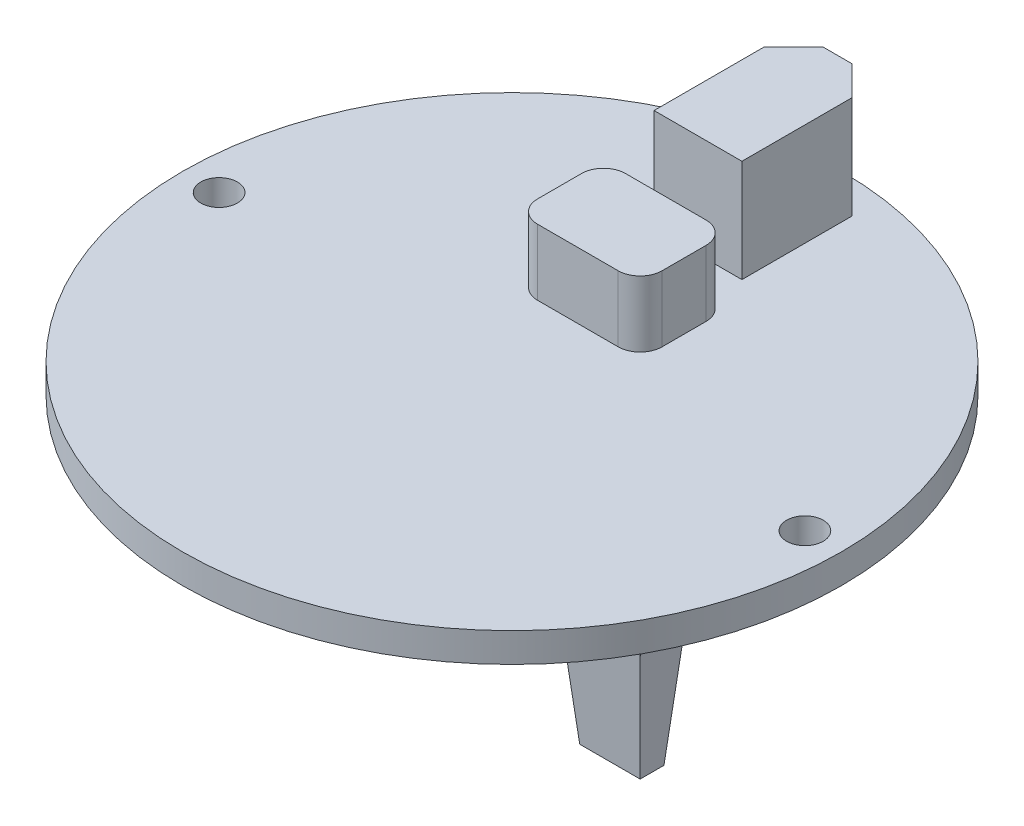
ISO-10303-21;
HEADER;
FILE_DESCRIPTION(('STEP AP214'),'2;1');
FILE_NAME('part.step','',(''),(''),'','','');
FILE_SCHEMA(('AUTOMOTIVE_DESIGN { 1 0 10303 214 1 1 1 1 }'));
ENDSEC;
DATA;
#1=APPLICATION_CONTEXT('core data for automotive mechanical design processes');
#2=APPLICATION_PROTOCOL_DEFINITION('international standard','automotive_design',2000,#1);
#3=PRODUCT_CONTEXT('',#1,'mechanical');
#4=PRODUCT('Part','Part','',(#3));
#5=PRODUCT_RELATED_PRODUCT_CATEGORY('part','',(#4));
#6=PRODUCT_DEFINITION_FORMATION('','',#4);
#7=PRODUCT_DEFINITION_CONTEXT('part definition',#1,'design');
#8=PRODUCT_DEFINITION('design','',#6,#7);
#9=PRODUCT_DEFINITION_SHAPE('','',#8);
#10=(LENGTH_UNIT() NAMED_UNIT(*) SI_UNIT(.MILLI.,.METRE.));
#11=(NAMED_UNIT(*) PLANE_ANGLE_UNIT() SI_UNIT($,.RADIAN.));
#12=(NAMED_UNIT(*) SI_UNIT($,.STERADIAN.) SOLID_ANGLE_UNIT());
#13=UNCERTAINTY_MEASURE_WITH_UNIT(LENGTH_MEASURE(1.E-05),#10,'distance_accuracy_value','');
#14=(GEOMETRIC_REPRESENTATION_CONTEXT(3) GLOBAL_UNCERTAINTY_ASSIGNED_CONTEXT((#13)) GLOBAL_UNIT_ASSIGNED_CONTEXT((#10,
#11,#12)) REPRESENTATION_CONTEXT('',''));
#15=CARTESIAN_POINT('',(0.,0.,0.));
#16=DIRECTION('',(0.,0.,1.));
#17=DIRECTION('',(1.,0.,0.));
#18=AXIS2_PLACEMENT_3D('',#15,#16,#17);
#19=CARTESIAN_POINT('',(-4.25,0.,0.));
#20=DIRECTION('',(-0.996194698091746,-0.0871557427476582,0.));
#21=DIRECTION('',(0.0871557427476582,-0.996194698091746,0.));
#22=AXIS2_PLACEMENT_3D('',#19,#20,#21);
#23=PLANE('',#22);
#24=DIRECTION('',(0.,0.,1.));
#25=VECTOR('',#24,1.);
#26=CARTESIAN_POINT('',(-4.25,0.,0.));
#27=LINE('',#26,#25);
#28=CARTESIAN_POINT('',(-4.25,0.,-9.));
#29=VERTEX_POINT('',#28);
#30=CARTESIAN_POINT('',(-4.25,0.,-6.));
#31=VERTEX_POINT('',#30);
#32=EDGE_CURVE('E172',#29,#31,#27,.T.);
#33=ORIENTED_EDGE('',*,*,#32,.F.);
#34=DIRECTION('',(-0.0871557427476582,0.996194698091746,0.));
#35=VECTOR('',#34,1.);
#36=CARTESIAN_POINT('',(-4.25,0.,-9.));
#37=LINE('',#36,#35);
#38=CARTESIAN_POINT('',(-2.75,-17.145078454142,-9.));
#39=VERTEX_POINT('',#38);
#40=EDGE_CURVE('E12',#39,#29,#37,.T.);
#41=ORIENTED_EDGE('',*,*,#40,.F.);
#42=DIRECTION('',(0.0868265938642476,-0.992432509138967,0.0868265938642476));
#43=VECTOR('',#42,1.);
#44=CARTESIAN_POINT('',(-4.1708419972783,-0.904780111291196,-10.4208419972783));
#45=LINE('',#44,#43);
#46=CARTESIAN_POINT('',(-2.0627834118519,-25.,-8.3127834118519));
#47=VERTEX_POINT('',#46);
#48=EDGE_CURVE('E59',#47,#39,#45,.F.);
#49=ORIENTED_EDGE('',*,*,#48,.F.);
#50=DIRECTION('',(0.,0.,1.));
#51=VECTOR('',#50,1.);
#52=CARTESIAN_POINT('',(-2.0627834118519,-25.,0.));
#53=LINE('',#52,#51);
#54=CARTESIAN_POINT('',(-2.0627834118519,-25.,-6.6872165881481));
#55=VERTEX_POINT('',#54);
#56=EDGE_CURVE('E197',#47,#55,#53,.T.);
#57=ORIENTED_EDGE('',*,*,#56,.T.);
#58=DIRECTION('',(-0.0868265938642476,0.992432509138967,0.0868265938642476));
#59=VECTOR('',#58,1.);
#60=CARTESIAN_POINT('',(-4.2839248583093,0.387762904839084,-4.4660751416907));
#61=LINE('',#60,#59);
#62=CARTESIAN_POINT('',(-2.75,-17.145078454142,-6.));
#63=VERTEX_POINT('',#62);
#64=EDGE_CURVE('E68',#55,#63,#61,.T.);
#65=ORIENTED_EDGE('',*,*,#64,.T.);
#66=DIRECTION('',(-0.0871557427476582,0.996194698091746,0.));
#67=VECTOR('',#66,1.);
#68=CARTESIAN_POINT('',(-4.25,0.,-6.));
#69=LINE('',#68,#67);
#70=EDGE_CURVE('E202',#63,#31,#69,.T.);
#71=ORIENTED_EDGE('',*,*,#70,.T.);
#72=EDGE_LOOP('',(#33,#41,#49,#57,#65,#71));
#73=FACE_BOUND('',#72,.T.);
#74=ADVANCED_FACE('F49',(#73),#23,.T.);
#75=CARTESIAN_POINT('',(-2.75,0.,-9.));
#76=DIRECTION('',(0.,1.,0.));
#77=DIRECTION('',(0.,0.,1.));
#78=AXIS2_PLACEMENT_3D('',#75,#76,#77);
#79=CONICAL_SURFACE('',#78,1.5,0.0872664625997165);
#80=DIRECTION('',(0.,0.996194698091746,-0.0871557427476582));
#81=VECTOR('',#80,1.);
#82=CARTESIAN_POINT('',(-2.75,0.,-10.5));
#83=LINE('',#82,#81);
#84=CARTESIAN_POINT('',(-2.75,0.,-10.5));
#85=VERTEX_POINT('',#84);
#86=EDGE_CURVE('E100',#39,#85,#83,.T.);
#87=ORIENTED_EDGE('',*,*,#86,.F.);
#88=ORIENTED_EDGE('',*,*,#40,.T.);
#89=CARTESIAN_POINT('',(-2.75,0.,-9.));
#90=DIRECTION('',(0.,1.,0.));
#91=DIRECTION('',(0.,0.,1.));
#92=AXIS2_PLACEMENT_3D('',#89,#90,#91);
#93=CIRCLE('',#92,1.5);
#94=EDGE_CURVE('E195',#85,#29,#93,.T.);
#95=ORIENTED_EDGE('',*,*,#94,.F.);
#96=EDGE_LOOP('',(#87,#88,#95));
#97=FACE_BOUND('',#96,.T.);
#98=ADVANCED_FACE('F51',(#97),#79,.T.);
#99=CARTESIAN_POINT('',(0.,0.,-10.5));
#100=DIRECTION('',(0.,-0.0871557427476582,-0.996194698091746));
#101=DIRECTION('',(0.,0.996194698091746,-0.0871557427476582));
#102=AXIS2_PLACEMENT_3D('',#99,#100,#101);
#103=PLANE('',#102);
#104=DIRECTION('',(1.,0.,0.));
#105=VECTOR('',#104,1.);
#106=CARTESIAN_POINT('',(0.,0.,-10.5));
#107=LINE('',#106,#105);
#108=CARTESIAN_POINT('',(2.75,0.,-10.5));
#109=VERTEX_POINT('',#108);
#110=EDGE_CURVE('E193',#85,#109,#107,.T.);
#111=ORIENTED_EDGE('',*,*,#110,.T.);
#112=DIRECTION('',(0.,0.996194698091746,-0.0871557427476582));
#113=VECTOR('',#112,1.);
#114=CARTESIAN_POINT('',(2.75,0.,-10.5));
#115=LINE('',#114,#113);
#116=CARTESIAN_POINT('',(2.75,-17.145078454142,-9.));
#117=VERTEX_POINT('',#116);
#118=EDGE_CURVE('E214',#117,#109,#115,.T.);
#119=ORIENTED_EDGE('',*,*,#118,.F.);
#120=DIRECTION('',(0.0868265938642476,0.992432509138967,-0.0868265938642476));
#121=VECTOR('',#120,1.);
#122=CARTESIAN_POINT('',(4.1708419972783,-0.904780111291196,-10.4208419972783));
#123=LINE('',#122,#121);
#124=CARTESIAN_POINT('',(2.0627834118519,-25.,-8.3127834118519));
#125=VERTEX_POINT('',#124);
#126=EDGE_CURVE('E212',#125,#117,#123,.T.);
#127=ORIENTED_EDGE('',*,*,#126,.F.);
#128=DIRECTION('',(-1.,0.,0.));
#129=VECTOR('',#128,1.);
#130=CARTESIAN_POINT('',(0.,-25.,-8.3127834118519));
#131=LINE('',#130,#129);
#132=EDGE_CURVE('E204',#47,#125,#131,.F.);
#133=ORIENTED_EDGE('',*,*,#132,.F.);
#134=ORIENTED_EDGE('',*,*,#48,.T.);
#135=ORIENTED_EDGE('',*,*,#86,.T.);
#136=EDGE_LOOP('',(#111,#119,#127,#133,#134,#135));
#137=FACE_BOUND('',#136,.T.);
#138=ADVANCED_FACE('F232',(#137),#103,.T.);
#139=CARTESIAN_POINT('',(2.75,0.,-9.));
#140=DIRECTION('',(0.,1.,0.));
#141=DIRECTION('',(0.,0.,1.));
#142=AXIS2_PLACEMENT_3D('',#139,#140,#141);
#143=CONICAL_SURFACE('',#142,1.5,0.0872664625997165);
#144=DIRECTION('',(0.0871557427476582,0.996194698091746,0.));
#145=VECTOR('',#144,1.);
#146=CARTESIAN_POINT('',(4.25,0.,-9.));
#147=LINE('',#146,#145);
#148=CARTESIAN_POINT('',(4.25,0.,-9.));
#149=VERTEX_POINT('',#148);
#150=EDGE_CURVE('E211',#117,#149,#147,.T.);
#151=ORIENTED_EDGE('',*,*,#150,.F.);
#152=ORIENTED_EDGE('',*,*,#118,.T.);
#153=CARTESIAN_POINT('',(2.75,0.,-9.));
#154=DIRECTION('',(0.,1.,0.));
#155=DIRECTION('',(0.,0.,1.));
#156=AXIS2_PLACEMENT_3D('',#153,#154,#155);
#157=CIRCLE('',#156,1.5);
#158=EDGE_CURVE('E190',#109,#149,#157,.F.);
#159=ORIENTED_EDGE('',*,*,#158,.T.);
#160=EDGE_LOOP('',(#151,#152,#159));
#161=FACE_BOUND('',#160,.T.);
#162=ADVANCED_FACE('F236',(#161),#143,.T.);
#163=CARTESIAN_POINT('',(4.25,0.,0.));
#164=DIRECTION('',(0.996194698091746,-0.0871557427476582,0.));
#165=DIRECTION('',(0.0871557427476582,0.996194698091746,0.));
#166=AXIS2_PLACEMENT_3D('',#163,#164,#165);
#167=PLANE('',#166);
#168=DIRECTION('',(0.,0.,1.));
#169=VECTOR('',#168,1.);
#170=CARTESIAN_POINT('',(4.25,0.,0.));
#171=LINE('',#170,#169);
#172=CARTESIAN_POINT('',(4.25,0.,-6.));
#173=VERTEX_POINT('',#172);
#174=EDGE_CURVE('E187',#149,#173,#171,.T.);
#175=ORIENTED_EDGE('',*,*,#174,.T.);
#176=DIRECTION('',(0.0871557427476582,0.996194698091746,0.));
#177=VECTOR('',#176,1.);
#178=CARTESIAN_POINT('',(4.25,0.,-6.));
#179=LINE('',#178,#177);
#180=CARTESIAN_POINT('',(2.75,-17.145078454142,-6.));
#181=VERTEX_POINT('',#180);
#182=EDGE_CURVE('E208',#181,#173,#179,.T.);
#183=ORIENTED_EDGE('',*,*,#182,.F.);
#184=DIRECTION('',(-0.0868265938642476,-0.992432509138967,-0.0868265938642476));
#185=VECTOR('',#184,1.);
#186=CARTESIAN_POINT('',(4.2839248583093,0.387762904839084,-4.4660751416907));
#187=LINE('',#186,#185);
#188=CARTESIAN_POINT('',(2.0627834118519,-25.,-6.6872165881481));
#189=VERTEX_POINT('',#188);
#190=EDGE_CURVE('E88',#189,#181,#187,.F.);
#191=ORIENTED_EDGE('',*,*,#190,.F.);
#192=DIRECTION('',(0.,0.,-1.));
#193=VECTOR('',#192,1.);
#194=CARTESIAN_POINT('',(2.0627834118519,-25.,0.));
#195=LINE('',#194,#193);
#196=EDGE_CURVE('E220',#125,#189,#195,.F.);
#197=ORIENTED_EDGE('',*,*,#196,.F.);
#198=ORIENTED_EDGE('',*,*,#126,.T.);
#199=ORIENTED_EDGE('',*,*,#150,.T.);
#200=EDGE_LOOP('',(#175,#183,#191,#197,#198,#199));
#201=FACE_BOUND('',#200,.T.);
#202=ADVANCED_FACE('F234',(#201),#167,.T.);
#203=CARTESIAN_POINT('',(2.75,0.,-6.));
#204=DIRECTION('',(0.,1.,0.));
#205=DIRECTION('',(0.,0.,1.));
#206=AXIS2_PLACEMENT_3D('',#203,#204,#205);
#207=CONICAL_SURFACE('',#206,1.5,0.0872664625997165);
#208=DIRECTION('',(0.,0.996194698091746,0.0871557427476582));
#209=VECTOR('',#208,1.);
#210=CARTESIAN_POINT('',(2.75,0.,-4.5));
#211=LINE('',#210,#209);
#212=CARTESIAN_POINT('',(2.75,0.,-4.5));
#213=VERTEX_POINT('',#212);
#214=EDGE_CURVE('E206',#181,#213,#211,.T.);
#215=ORIENTED_EDGE('',*,*,#214,.F.);
#216=ORIENTED_EDGE('',*,*,#182,.T.);
#217=CARTESIAN_POINT('',(2.75,0.,-6.));
#218=DIRECTION('',(0.,1.,0.));
#219=DIRECTION('',(0.,0.,1.));
#220=AXIS2_PLACEMENT_3D('',#217,#218,#219);
#221=CIRCLE('',#220,1.5);
#222=EDGE_CURVE('E184',#213,#173,#221,.T.);
#223=ORIENTED_EDGE('',*,*,#222,.F.);
#224=EDGE_LOOP('',(#215,#216,#223));
#225=FACE_BOUND('',#224,.T.);
#226=ADVANCED_FACE('F257',(#225),#207,.T.);
#227=CARTESIAN_POINT('',(0.,0.,-4.5));
#228=DIRECTION('',(0.,-0.0871557427476582,0.996194698091746));
#229=DIRECTION('',(0.,-0.996194698091746,-0.0871557427476582));
#230=AXIS2_PLACEMENT_3D('',#227,#228,#229);
#231=PLANE('',#230);
#232=DIRECTION('',(1.,0.,0.));
#233=VECTOR('',#232,1.);
#234=CARTESIAN_POINT('',(0.,0.,-4.5));
#235=LINE('',#234,#233);
#236=CARTESIAN_POINT('',(-2.75,0.,-4.5));
#237=VERTEX_POINT('',#236);
#238=EDGE_CURVE('E181',#237,#213,#235,.T.);
#239=ORIENTED_EDGE('',*,*,#238,.F.);
#240=DIRECTION('',(0.,0.996194698091746,0.0871557427476582));
#241=VECTOR('',#240,1.);
#242=CARTESIAN_POINT('',(-2.75,0.,-4.5));
#243=LINE('',#242,#241);
#244=EDGE_CURVE('E201',#63,#237,#243,.T.);
#245=ORIENTED_EDGE('',*,*,#244,.F.);
#246=ORIENTED_EDGE('',*,*,#64,.F.);
#247=DIRECTION('',(1.,0.,0.));
#248=VECTOR('',#247,1.);
#249=CARTESIAN_POINT('',(0.,-25.,-6.6872165881481));
#250=LINE('',#249,#248);
#251=EDGE_CURVE('E53',#55,#189,#250,.T.);
#252=ORIENTED_EDGE('',*,*,#251,.T.);
#253=ORIENTED_EDGE('',*,*,#190,.T.);
#254=ORIENTED_EDGE('',*,*,#214,.T.);
#255=EDGE_LOOP('',(#239,#245,#246,#252,#253,#254));
#256=FACE_BOUND('',#255,.T.);
#257=ADVANCED_FACE('F223',(#256),#231,.T.);
#258=CARTESIAN_POINT('',(-2.75,0.,-6.));
#259=DIRECTION('',(0.,1.,0.));
#260=DIRECTION('',(0.,0.,1.));
#261=AXIS2_PLACEMENT_3D('',#258,#259,#260);
#262=CONICAL_SURFACE('',#261,1.5,0.0872664625997165);
#263=ORIENTED_EDGE('',*,*,#70,.F.);
#264=ORIENTED_EDGE('',*,*,#244,.T.);
#265=CARTESIAN_POINT('',(-2.75,0.,-6.));
#266=DIRECTION('',(0.,1.,0.));
#267=DIRECTION('',(0.,0.,1.));
#268=AXIS2_PLACEMENT_3D('',#265,#266,#267);
#269=CIRCLE('',#268,1.5);
#270=EDGE_CURVE('E174',#31,#237,#269,.T.);
#271=ORIENTED_EDGE('',*,*,#270,.F.);
#272=EDGE_LOOP('',(#263,#264,#271));
#273=FACE_BOUND('',#272,.T.);
#274=ADVANCED_FACE('F291',(#273),#262,.T.);
#275=CARTESIAN_POINT('',(0.,-25.,0.));
#276=DIRECTION('',(0.,1.,0.));
#277=DIRECTION('',(0.,0.,1.));
#278=AXIS2_PLACEMENT_3D('',#275,#276,#277);
#279=PLANE('',#278);
#280=ORIENTED_EDGE('',*,*,#56,.F.);
#281=ORIENTED_EDGE('',*,*,#132,.T.);
#282=ORIENTED_EDGE('',*,*,#196,.T.);
#283=ORIENTED_EDGE('',*,*,#251,.F.);
#284=EDGE_LOOP('',(#280,#281,#282,#283));
#285=FACE_BOUND('',#284,.T.);
#286=ADVANCED_FACE('F229',(#285),#279,.F.);
#287=CARTESIAN_POINT('',(-4.25,6.5,0.));
#288=DIRECTION('',(1.,0.,0.));
#289=DIRECTION('',(0.,0.,-1.));
#290=AXIS2_PLACEMENT_3D('',#287,#288,#289);
#291=PLANE('',#290);
#292=ORIENTED_EDGE('',*,*,#32,.T.);
#293=DIRECTION('',(0.,-1.,0.));
#294=VECTOR('',#293,1.);
#295=CARTESIAN_POINT('',(-4.25,6.5,-6.));
#296=LINE('',#295,#294);
#297=CARTESIAN_POINT('',(-4.25,6.5,-6.));
#298=VERTEX_POINT('',#297);
#299=EDGE_CURVE('E153',#298,#31,#296,.T.);
#300=ORIENTED_EDGE('',*,*,#299,.F.);
#301=DIRECTION('',(0.,0.,1.));
#302=VECTOR('',#301,1.);
#303=CARTESIAN_POINT('',(-4.25,6.5,0.));
#304=LINE('',#303,#302);
#305=CARTESIAN_POINT('',(-4.25,6.5,-9.));
#306=VERTEX_POINT('',#305);
#307=EDGE_CURVE('E160',#306,#298,#304,.T.);
#308=ORIENTED_EDGE('',*,*,#307,.F.);
#309=DIRECTION('',(0.,-1.,0.));
#310=VECTOR('',#309,1.);
#311=CARTESIAN_POINT('',(-4.25,6.5,-9.));
#312=LINE('',#311,#310);
#313=EDGE_CURVE('E276',#306,#29,#312,.T.);
#314=ORIENTED_EDGE('',*,*,#313,.T.);
#315=EDGE_LOOP('',(#292,#300,#308,#314));
#316=FACE_BOUND('',#315,.T.);
#317=ADVANCED_FACE('F171',(#316),#291,.F.);
#318=CARTESIAN_POINT('',(-2.75,6.5,-6.));
#319=DIRECTION('',(0.,-1.,0.));
#320=DIRECTION('',(0.,0.,-1.));
#321=AXIS2_PLACEMENT_3D('',#318,#319,#320);
#322=CYLINDRICAL_SURFACE('',#321,1.5);
#323=ORIENTED_EDGE('',*,*,#270,.T.);
#324=DIRECTION('',(0.,-1.,0.));
#325=VECTOR('',#324,1.);
#326=CARTESIAN_POINT('',(-2.75,6.5,-4.5));
#327=LINE('',#326,#325);
#328=CARTESIAN_POINT('',(-2.75,6.5,-4.5));
#329=VERTEX_POINT('',#328);
#330=EDGE_CURVE('E156',#329,#237,#327,.T.);
#331=ORIENTED_EDGE('',*,*,#330,.F.);
#332=CARTESIAN_POINT('',(-2.75,6.5,-6.));
#333=DIRECTION('',(0.,1.,0.));
#334=DIRECTION('',(0.,0.,1.));
#335=AXIS2_PLACEMENT_3D('',#332,#333,#334);
#336=CIRCLE('',#335,1.5);
#337=EDGE_CURVE('E148',#298,#329,#336,.T.);
#338=ORIENTED_EDGE('',*,*,#337,.F.);
#339=ORIENTED_EDGE('',*,*,#299,.T.);
#340=EDGE_LOOP('',(#323,#331,#338,#339));
#341=FACE_BOUND('',#340,.T.);
#342=ADVANCED_FACE('F151',(#341),#322,.T.);
#343=CARTESIAN_POINT('',(0.,6.5,-4.5));
#344=DIRECTION('',(0.,0.,-1.));
#345=DIRECTION('',(-1.,0.,0.));
#346=AXIS2_PLACEMENT_3D('',#343,#344,#345);
#347=PLANE('',#346);
#348=ORIENTED_EDGE('',*,*,#238,.T.);
#349=DIRECTION('',(0.,-1.,0.));
#350=VECTOR('',#349,1.);
#351=CARTESIAN_POINT('',(2.75,6.5,-4.5));
#352=LINE('',#351,#350);
#353=CARTESIAN_POINT('',(2.75,6.5,-4.5));
#354=VERTEX_POINT('',#353);
#355=EDGE_CURVE('E176',#354,#213,#352,.T.);
#356=ORIENTED_EDGE('',*,*,#355,.F.);
#357=DIRECTION('',(1.,0.,0.));
#358=VECTOR('',#357,1.);
#359=CARTESIAN_POINT('',(0.,6.5,-4.5));
#360=LINE('',#359,#358);
#361=EDGE_CURVE('E159',#329,#354,#360,.T.);
#362=ORIENTED_EDGE('',*,*,#361,.F.);
#363=ORIENTED_EDGE('',*,*,#330,.T.);
#364=EDGE_LOOP('',(#348,#356,#362,#363));
#365=FACE_BOUND('',#364,.T.);
#366=ADVANCED_FACE('F263',(#365),#347,.F.);
#367=CARTESIAN_POINT('',(2.75,6.5,-6.));
#368=DIRECTION('',(0.,-1.,0.));
#369=DIRECTION('',(0.,0.,-1.));
#370=AXIS2_PLACEMENT_3D('',#367,#368,#369);
#371=CYLINDRICAL_SURFACE('',#370,1.5);
#372=ORIENTED_EDGE('',*,*,#222,.T.);
#373=DIRECTION('',(0.,-1.,0.));
#374=VECTOR('',#373,1.);
#375=CARTESIAN_POINT('',(4.25,6.5,-6.));
#376=LINE('',#375,#374);
#377=CARTESIAN_POINT('',(4.25,6.5,-6.));
#378=VERTEX_POINT('',#377);
#379=EDGE_CURVE('E249',#378,#173,#376,.T.);
#380=ORIENTED_EDGE('',*,*,#379,.F.);
#381=CARTESIAN_POINT('',(2.75,6.5,-6.));
#382=DIRECTION('',(0.,1.,0.));
#383=DIRECTION('',(0.,0.,1.));
#384=AXIS2_PLACEMENT_3D('',#381,#382,#383);
#385=CIRCLE('',#384,1.5);
#386=EDGE_CURVE('E265',#354,#378,#385,.T.);
#387=ORIENTED_EDGE('',*,*,#386,.F.);
#388=ORIENTED_EDGE('',*,*,#355,.T.);
#389=EDGE_LOOP('',(#372,#380,#387,#388));
#390=FACE_BOUND('',#389,.T.);
#391=ADVANCED_FACE('F284',(#390),#371,.T.);
#392=CARTESIAN_POINT('',(4.25,6.5,0.));
#393=DIRECTION('',(1.,0.,0.));
#394=DIRECTION('',(0.,0.,-1.));
#395=AXIS2_PLACEMENT_3D('',#392,#393,#394);
#396=PLANE('',#395);
#397=ORIENTED_EDGE('',*,*,#174,.F.);
#398=DIRECTION('',(0.,-1.,0.));
#399=VECTOR('',#398,1.);
#400=CARTESIAN_POINT('',(4.25,6.5,-9.));
#401=LINE('',#400,#399);
#402=CARTESIAN_POINT('',(4.25,6.5,-9.));
#403=VERTEX_POINT('',#402);
#404=EDGE_CURVE('E241',#403,#149,#401,.T.);
#405=ORIENTED_EDGE('',*,*,#404,.F.);
#406=DIRECTION('',(0.,0.,1.));
#407=VECTOR('',#406,1.);
#408=CARTESIAN_POINT('',(4.25,6.5,0.));
#409=LINE('',#408,#407);
#410=EDGE_CURVE('E267',#403,#378,#409,.T.);
#411=ORIENTED_EDGE('',*,*,#410,.T.);
#412=ORIENTED_EDGE('',*,*,#379,.T.);
#413=EDGE_LOOP('',(#397,#405,#411,#412));
#414=FACE_BOUND('',#413,.T.);
#415=ADVANCED_FACE('F253',(#414),#396,.T.);
#416=CARTESIAN_POINT('',(2.75,6.5,-9.));
#417=DIRECTION('',(0.,-1.,0.));
#418=DIRECTION('',(0.,0.,-1.));
#419=AXIS2_PLACEMENT_3D('',#416,#417,#418);
#420=CYLINDRICAL_SURFACE('',#419,1.5);
#421=ORIENTED_EDGE('',*,*,#158,.F.);
#422=DIRECTION('',(0.,-1.,0.));
#423=VECTOR('',#422,1.);
#424=CARTESIAN_POINT('',(2.75,6.5,-10.5));
#425=LINE('',#424,#423);
#426=CARTESIAN_POINT('',(2.75,6.5,-10.5));
#427=VERTEX_POINT('',#426);
#428=EDGE_CURVE('E250',#427,#109,#425,.T.);
#429=ORIENTED_EDGE('',*,*,#428,.F.);
#430=CARTESIAN_POINT('',(2.75,6.5,-9.));
#431=DIRECTION('',(0.,1.,0.));
#432=DIRECTION('',(0.,0.,1.));
#433=AXIS2_PLACEMENT_3D('',#430,#431,#432);
#434=CIRCLE('',#433,1.5);
#435=EDGE_CURVE('E245',#427,#403,#434,.F.);
#436=ORIENTED_EDGE('',*,*,#435,.T.);
#437=ORIENTED_EDGE('',*,*,#404,.T.);
#438=EDGE_LOOP('',(#421,#429,#436,#437));
#439=FACE_BOUND('',#438,.T.);
#440=ADVANCED_FACE('F243',(#439),#420,.T.);
#441=CARTESIAN_POINT('',(0.,6.5,-10.5));
#442=DIRECTION('',(0.,0.,-1.));
#443=DIRECTION('',(-1.,0.,0.));
#444=AXIS2_PLACEMENT_3D('',#441,#442,#443);
#445=PLANE('',#444);
#446=ORIENTED_EDGE('',*,*,#110,.F.);
#447=DIRECTION('',(0.,-1.,0.));
#448=VECTOR('',#447,1.);
#449=CARTESIAN_POINT('',(-2.75,6.5,-10.5));
#450=LINE('',#449,#448);
#451=CARTESIAN_POINT('',(-2.75,6.5,-10.5));
#452=VERTEX_POINT('',#451);
#453=EDGE_CURVE('E278',#452,#85,#450,.T.);
#454=ORIENTED_EDGE('',*,*,#453,.F.);
#455=DIRECTION('',(1.,0.,0.));
#456=VECTOR('',#455,1.);
#457=CARTESIAN_POINT('',(0.,6.5,-10.5));
#458=LINE('',#457,#456);
#459=EDGE_CURVE('E272',#452,#427,#458,.T.);
#460=ORIENTED_EDGE('',*,*,#459,.T.);
#461=ORIENTED_EDGE('',*,*,#428,.T.);
#462=EDGE_LOOP('',(#446,#454,#460,#461));
#463=FACE_BOUND('',#462,.T.);
#464=ADVANCED_FACE('F287',(#463),#445,.T.);
#465=CARTESIAN_POINT('',(-2.75,6.5,-9.));
#466=DIRECTION('',(0.,-1.,0.));
#467=DIRECTION('',(0.,0.,-1.));
#468=AXIS2_PLACEMENT_3D('',#465,#466,#467);
#469=CYLINDRICAL_SURFACE('',#468,1.5);
#470=ORIENTED_EDGE('',*,*,#94,.T.);
#471=ORIENTED_EDGE('',*,*,#313,.F.);
#472=CARTESIAN_POINT('',(-2.75,6.5,-9.));
#473=DIRECTION('',(0.,1.,0.));
#474=DIRECTION('',(0.,0.,1.));
#475=AXIS2_PLACEMENT_3D('',#472,#473,#474);
#476=CIRCLE('',#475,1.5);
#477=EDGE_CURVE('E166',#452,#306,#476,.T.);
#478=ORIENTED_EDGE('',*,*,#477,.F.);
#479=ORIENTED_EDGE('',*,*,#453,.T.);
#480=EDGE_LOOP('',(#470,#471,#478,#479));
#481=FACE_BOUND('',#480,.T.);
#482=ADVANCED_FACE('F289',(#481),#469,.T.);
#483=CARTESIAN_POINT('',(0.,6.5,0.));
#484=DIRECTION('',(0.,1.,0.));
#485=DIRECTION('',(0.,0.,1.));
#486=AXIS2_PLACEMENT_3D('',#483,#484,#485);
#487=PLANE('',#486);
#488=ORIENTED_EDGE('',*,*,#307,.T.);
#489=ORIENTED_EDGE('',*,*,#337,.T.);
#490=ORIENTED_EDGE('',*,*,#361,.T.);
#491=ORIENTED_EDGE('',*,*,#386,.T.);
#492=ORIENTED_EDGE('',*,*,#410,.F.);
#493=ORIENTED_EDGE('',*,*,#435,.F.);
#494=ORIENTED_EDGE('',*,*,#459,.F.);
#495=ORIENTED_EDGE('',*,*,#477,.T.);
#496=EDGE_LOOP('',(#488,#489,#490,#491,#492,#493,#494,#495));
#497=FACE_BOUND('',#496,.T.);
#498=ADVANCED_FACE('F163',(#497),#487,.T.);
#499=CLOSED_SHELL('',(#74,#98,#138,#162,#202,#226,#257,#274,#286,#317,#342,#366,#391,#415,#440,
#464,#482,#498));
#500=MANIFOLD_SOLID_BREP('B2',#499);
#501=CARTESIAN_POINT('',(0.,2.,0.));
#502=DIRECTION('',(0.,1.,0.));
#503=DIRECTION('',(0.,0.,1.));
#504=AXIS2_PLACEMENT_3D('',#501,#502,#503);
#505=PLANE('',#504);
#506=CARTESIAN_POINT('',(20.,2.,0.));
#507=DIRECTION('',(0.,1.,0.));
#508=DIRECTION('',(0.,0.,1.));
#509=AXIS2_PLACEMENT_3D('',#506,#507,#508);
#510=CIRCLE('',#509,1.25);
#511=CARTESIAN_POINT('',(20.,2.,1.24999999999999));
#512=VERTEX_POINT('',#511);
#513=EDGE_CURVE('E578',#512,#512,#510,.T.);
#514=ORIENTED_EDGE('',*,*,#513,.F.);
#515=EDGE_LOOP('',(#514));
#516=FACE_BOUND('',#515,.T.);
#517=CARTESIAN_POINT('',(0.,2.,0.));
#518=DIRECTION('',(0.,1.,0.));
#519=DIRECTION('',(0.,0.,1.));
#520=AXIS2_PLACEMENT_3D('',#517,#518,#519);
#521=CIRCLE('',#520,22.5);
#522=CARTESIAN_POINT('',(0.,2.,22.5));
#523=VERTEX_POINT('',#522);
#524=EDGE_CURVE('E47',#523,#523,#521,.T.);
#525=ORIENTED_EDGE('',*,*,#524,.T.);
#526=EDGE_LOOP('',(#525));
#527=FACE_BOUND('',#526,.T.);
#528=CARTESIAN_POINT('',(-20.,2.,0.));
#529=DIRECTION('',(0.,1.,0.));
#530=DIRECTION('',(0.,0.,1.));
#531=AXIS2_PLACEMENT_3D('',#528,#529,#530);
#532=CIRCLE('',#531,1.25);
#533=CARTESIAN_POINT('',(-20.,2.,1.25));
#534=VERTEX_POINT('',#533);
#535=EDGE_CURVE('E584',#534,#534,#532,.T.);
#536=ORIENTED_EDGE('',*,*,#535,.F.);
#537=EDGE_LOOP('',(#536));
#538=FACE_BOUND('',#537,.T.);
#539=DIRECTION('',(-0.707106781186547,0.,-0.707106781186548));
#540=VECTOR('',#539,1.);
#541=CARTESIAN_POINT('',(0.999999999999996,2.,-22.225));
#542=LINE('',#541,#540);
#543=CARTESIAN_POINT('',(3.,2.,-20.225));
#544=VERTEX_POINT('',#543);
#545=CARTESIAN_POINT('',(0.999999999999996,2.,-22.225));
#546=VERTEX_POINT('',#545);
#547=EDGE_CURVE('E560',#544,#546,#542,.T.);
#548=ORIENTED_EDGE('',*,*,#547,.F.);
#549=DIRECTION('',(0.,0.,-1.));
#550=VECTOR('',#549,1.);
#551=CARTESIAN_POINT('',(3.,2.,-20.225));
#552=LINE('',#551,#550);
#553=CARTESIAN_POINT('',(3.,2.,-12.7));
#554=VERTEX_POINT('',#553);
#555=EDGE_CURVE('E557',#554,#544,#552,.T.);
#556=ORIENTED_EDGE('',*,*,#555,.F.);
#557=DIRECTION('',(1.,0.,0.));
#558=VECTOR('',#557,1.);
#559=CARTESIAN_POINT('',(-3.,2.,-12.7));
#560=LINE('',#559,#558);
#561=CARTESIAN_POINT('',(-3.,2.,-12.7));
#562=VERTEX_POINT('',#561);
#563=EDGE_CURVE('E516',#562,#554,#560,.T.);
#564=ORIENTED_EDGE('',*,*,#563,.F.);
#565=DIRECTION('',(0.,0.,1.));
#566=VECTOR('',#565,1.);
#567=CARTESIAN_POINT('',(-3.,2.,-20.225));
#568=LINE('',#567,#566);
#569=CARTESIAN_POINT('',(-3.,2.,-20.225));
#570=VERTEX_POINT('',#569);
#571=EDGE_CURVE('E565',#570,#562,#568,.T.);
#572=ORIENTED_EDGE('',*,*,#571,.F.);
#573=DIRECTION('',(-0.707106781186547,0.,0.707106781186548));
#574=VECTOR('',#573,1.);
#575=CARTESIAN_POINT('',(-3.,2.,-20.225));
#576=LINE('',#575,#574);
#577=CARTESIAN_POINT('',(-1.,2.,-22.225));
#578=VERTEX_POINT('',#577);
#579=EDGE_CURVE('E546',#578,#570,#576,.T.);
#580=ORIENTED_EDGE('',*,*,#579,.F.);
#581=DIRECTION('',(-1.,0.,0.));
#582=VECTOR('',#581,1.);
#583=CARTESIAN_POINT('',(-1.,2.,-22.225));
#584=LINE('',#583,#582);
#585=EDGE_CURVE('E562',#546,#578,#584,.T.);
#586=ORIENTED_EDGE('',*,*,#585,.F.);
#587=EDGE_LOOP('',(#548,#556,#564,#572,#580,#586));
#588=FACE_BOUND('',#587,.T.);
#589=ADVANCED_FACE('F473',(#516,#527,#538,#588),#505,.T.);
#590=CARTESIAN_POINT('',(0.,0.,0.));
#591=DIRECTION('',(0.,1.,0.));
#592=DIRECTION('',(0.,0.,1.));
#593=AXIS2_PLACEMENT_3D('',#590,#591,#592);
#594=PLANE('',#593);
#595=CARTESIAN_POINT('',(-20.,0.,0.));
#596=DIRECTION('',(0.,1.,0.));
#597=DIRECTION('',(0.,0.,1.));
#598=AXIS2_PLACEMENT_3D('',#595,#596,#597);
#599=CIRCLE('',#598,1.25);
#600=CARTESIAN_POINT('',(-20.,0.,1.25));
#601=VERTEX_POINT('',#600);
#602=EDGE_CURVE('E581',#601,#601,#599,.T.);
#603=ORIENTED_EDGE('',*,*,#602,.T.);
#604=EDGE_LOOP('',(#603));
#605=FACE_BOUND('',#604,.T.);
#606=CARTESIAN_POINT('',(0.,0.,0.));
#607=DIRECTION('',(0.,1.,0.));
#608=DIRECTION('',(0.,0.,1.));
#609=AXIS2_PLACEMENT_3D('',#606,#607,#608);
#610=CIRCLE('',#609,22.5);
#611=CARTESIAN_POINT('',(0.,0.,22.5));
#612=VERTEX_POINT('',#611);
#613=EDGE_CURVE('E477',#612,#612,#610,.T.);
#614=ORIENTED_EDGE('',*,*,#613,.F.);
#615=EDGE_LOOP('',(#614));
#616=FACE_BOUND('',#615,.T.);
#617=CARTESIAN_POINT('',(20.,0.,0.));
#618=DIRECTION('',(0.,1.,0.));
#619=DIRECTION('',(0.,0.,1.));
#620=AXIS2_PLACEMENT_3D('',#617,#618,#619);
#621=CIRCLE('',#620,1.25);
#622=CARTESIAN_POINT('',(20.,0.,1.24999999999999));
#623=VERTEX_POINT('',#622);
#624=EDGE_CURVE('E577',#623,#623,#621,.T.);
#625=ORIENTED_EDGE('',*,*,#624,.T.);
#626=EDGE_LOOP('',(#625));
#627=FACE_BOUND('',#626,.T.);
#628=ADVANCED_FACE('F590',(#605,#616,#627),#594,.F.);
#629=CARTESIAN_POINT('',(0.,2.,0.));
#630=DIRECTION('',(0.,-1.,0.));
#631=DIRECTION('',(0.,0.,-1.));
#632=AXIS2_PLACEMENT_3D('',#629,#630,#631);
#633=CYLINDRICAL_SURFACE('',#632,22.5);
#634=ORIENTED_EDGE('',*,*,#524,.F.);
#635=EDGE_LOOP('',(#634));
#636=FACE_BOUND('',#635,.T.);
#637=ORIENTED_EDGE('',*,*,#613,.T.);
#638=EDGE_LOOP('',(#637));
#639=FACE_BOUND('',#638,.T.);
#640=ADVANCED_FACE('F475',(#636,#639),#633,.T.);
#641=CARTESIAN_POINT('',(-20.,2.,0.));
#642=DIRECTION('',(0.,-1.,0.));
#643=DIRECTION('',(0.,0.,-1.));
#644=AXIS2_PLACEMENT_3D('',#641,#642,#643);
#645=CYLINDRICAL_SURFACE('',#644,1.25);
#646=ORIENTED_EDGE('',*,*,#535,.T.);
#647=EDGE_LOOP('',(#646));
#648=FACE_BOUND('',#647,.T.);
#649=ORIENTED_EDGE('',*,*,#602,.F.);
#650=EDGE_LOOP('',(#649));
#651=FACE_BOUND('',#650,.T.);
#652=ADVANCED_FACE('F593',(#648,#651),#645,.F.);
#653=CARTESIAN_POINT('',(20.,2.,0.));
#654=DIRECTION('',(0.,-1.,0.));
#655=DIRECTION('',(0.,0.,-1.));
#656=AXIS2_PLACEMENT_3D('',#653,#654,#655);
#657=CYLINDRICAL_SURFACE('',#656,1.25);
#658=ORIENTED_EDGE('',*,*,#513,.T.);
#659=EDGE_LOOP('',(#658));
#660=FACE_BOUND('',#659,.T.);
#661=ORIENTED_EDGE('',*,*,#624,.F.);
#662=EDGE_LOOP('',(#661));
#663=FACE_BOUND('',#662,.T.);
#664=ADVANCED_FACE('F595',(#660,#663),#657,.F.);
#665=CARTESIAN_POINT('',(3.,9.,-20.225));
#666=DIRECTION('',(-1.,0.,0.));
#667=DIRECTION('',(0.,0.,1.));
#668=AXIS2_PLACEMENT_3D('',#665,#666,#667);
#669=PLANE('',#668);
#670=ORIENTED_EDGE('',*,*,#555,.T.);
#671=DIRECTION('',(0.,-1.,0.));
#672=VECTOR('',#671,1.);
#673=CARTESIAN_POINT('',(3.,9.,-20.225));
#674=LINE('',#673,#672);
#675=CARTESIAN_POINT('',(3.,9.,-20.225));
#676=VERTEX_POINT('',#675);
#677=EDGE_CURVE('E575',#676,#544,#674,.T.);
#678=ORIENTED_EDGE('',*,*,#677,.F.);
#679=DIRECTION('',(0.,0.,-1.));
#680=VECTOR('',#679,1.);
#681=CARTESIAN_POINT('',(3.,9.,-20.225));
#682=LINE('',#681,#680);
#683=CARTESIAN_POINT('',(3.,9.,-12.7));
#684=VERTEX_POINT('',#683);
#685=EDGE_CURVE('E568',#684,#676,#682,.T.);
#686=ORIENTED_EDGE('',*,*,#685,.F.);
#687=DIRECTION('',(0.,-1.,0.));
#688=VECTOR('',#687,1.);
#689=CARTESIAN_POINT('',(3.,9.,-12.7));
#690=LINE('',#689,#688);
#691=EDGE_CURVE('E553',#684,#554,#690,.T.);
#692=ORIENTED_EDGE('',*,*,#691,.T.);
#693=EDGE_LOOP('',(#670,#678,#686,#692));
#694=FACE_BOUND('',#693,.T.);
#695=ADVANCED_FACE('F602',(#694),#669,.F.);
#696=CARTESIAN_POINT('',(0.999999999999996,9.,-22.225));
#697=DIRECTION('',(-0.707106781186548,0.,0.707106781186547));
#698=DIRECTION('',(0.707106781186547,0.,0.707106781186548));
#699=AXIS2_PLACEMENT_3D('',#696,#697,#698);
#700=PLANE('',#699);
#701=ORIENTED_EDGE('',*,*,#547,.T.);
#702=DIRECTION('',(0.,-1.,0.));
#703=VECTOR('',#702,1.);
#704=CARTESIAN_POINT('',(0.999999999999996,9.,-22.225));
#705=LINE('',#704,#703);
#706=CARTESIAN_POINT('',(0.999999999999996,9.,-22.225));
#707=VERTEX_POINT('',#706);
#708=EDGE_CURVE('E572',#707,#546,#705,.T.);
#709=ORIENTED_EDGE('',*,*,#708,.F.);
#710=DIRECTION('',(-0.707106781186547,0.,-0.707106781186548));
#711=VECTOR('',#710,1.);
#712=CARTESIAN_POINT('',(0.999999999999996,9.,-22.225));
#713=LINE('',#712,#711);
#714=EDGE_CURVE('E524',#676,#707,#713,.T.);
#715=ORIENTED_EDGE('',*,*,#714,.F.);
#716=ORIENTED_EDGE('',*,*,#677,.T.);
#717=EDGE_LOOP('',(#701,#709,#715,#716));
#718=FACE_BOUND('',#717,.T.);
#719=ADVANCED_FACE('F621',(#718),#700,.F.);
#720=CARTESIAN_POINT('',(-1.,9.,-22.225));
#721=DIRECTION('',(0.,0.,1.));
#722=DIRECTION('',(1.,0.,0.));
#723=AXIS2_PLACEMENT_3D('',#720,#721,#722);
#724=PLANE('',#723);
#725=ORIENTED_EDGE('',*,*,#585,.T.);
#726=DIRECTION('',(0.,-1.,0.));
#727=VECTOR('',#726,1.);
#728=CARTESIAN_POINT('',(-1.,9.,-22.225));
#729=LINE('',#728,#727);
#730=CARTESIAN_POINT('',(-1.,9.,-22.225));
#731=VERTEX_POINT('',#730);
#732=EDGE_CURVE('E549',#731,#578,#729,.T.);
#733=ORIENTED_EDGE('',*,*,#732,.F.);
#734=DIRECTION('',(-1.,0.,0.));
#735=VECTOR('',#734,1.);
#736=CARTESIAN_POINT('',(-1.,9.,-22.225));
#737=LINE('',#736,#735);
#738=EDGE_CURVE('E537',#707,#731,#737,.T.);
#739=ORIENTED_EDGE('',*,*,#738,.F.);
#740=ORIENTED_EDGE('',*,*,#708,.T.);
#741=EDGE_LOOP('',(#725,#733,#739,#740));
#742=FACE_BOUND('',#741,.T.);
#743=ADVANCED_FACE('F624',(#742),#724,.F.);
#744=CARTESIAN_POINT('',(-3.,9.,-20.225));
#745=DIRECTION('',(0.707106781186548,0.,0.707106781186547));
#746=DIRECTION('',(0.707106781186547,0.,-0.707106781186548));
#747=AXIS2_PLACEMENT_3D('',#744,#745,#746);
#748=PLANE('',#747);
#749=ORIENTED_EDGE('',*,*,#579,.T.);
#750=DIRECTION('',(0.,-1.,0.));
#751=VECTOR('',#750,1.);
#752=CARTESIAN_POINT('',(-3.,9.,-20.225));
#753=LINE('',#752,#751);
#754=CARTESIAN_POINT('',(-3.,9.,-20.225));
#755=VERTEX_POINT('',#754);
#756=EDGE_CURVE('E543',#755,#570,#753,.T.);
#757=ORIENTED_EDGE('',*,*,#756,.F.);
#758=DIRECTION('',(-0.707106781186547,0.,0.707106781186548));
#759=VECTOR('',#758,1.);
#760=CARTESIAN_POINT('',(-3.,9.,-20.225));
#761=LINE('',#760,#759);
#762=EDGE_CURVE('E531',#731,#755,#761,.T.);
#763=ORIENTED_EDGE('',*,*,#762,.F.);
#764=ORIENTED_EDGE('',*,*,#732,.T.);
#765=EDGE_LOOP('',(#749,#757,#763,#764));
#766=FACE_BOUND('',#765,.T.);
#767=ADVANCED_FACE('F544',(#766),#748,.F.);
#768=CARTESIAN_POINT('',(-3.,9.,-20.225));
#769=DIRECTION('',(1.,0.,0.));
#770=DIRECTION('',(0.,0.,-1.));
#771=AXIS2_PLACEMENT_3D('',#768,#769,#770);
#772=PLANE('',#771);
#773=ORIENTED_EDGE('',*,*,#571,.T.);
#774=DIRECTION('',(0.,-1.,0.));
#775=VECTOR('',#774,1.);
#776=CARTESIAN_POINT('',(-3.,9.,-12.7));
#777=LINE('',#776,#775);
#778=CARTESIAN_POINT('',(-3.,9.,-12.7));
#779=VERTEX_POINT('',#778);
#780=EDGE_CURVE('E488',#779,#562,#777,.T.);
#781=ORIENTED_EDGE('',*,*,#780,.F.);
#782=DIRECTION('',(0.,0.,1.));
#783=VECTOR('',#782,1.);
#784=CARTESIAN_POINT('',(-3.,9.,-20.225));
#785=LINE('',#784,#783);
#786=EDGE_CURVE('E535',#755,#779,#785,.T.);
#787=ORIENTED_EDGE('',*,*,#786,.F.);
#788=ORIENTED_EDGE('',*,*,#756,.T.);
#789=EDGE_LOOP('',(#773,#781,#787,#788));
#790=FACE_BOUND('',#789,.T.);
#791=ADVANCED_FACE('F551',(#790),#772,.F.);
#792=CARTESIAN_POINT('',(-3.,9.,-12.7));
#793=DIRECTION('',(0.,0.,-1.));
#794=DIRECTION('',(-1.,0.,0.));
#795=AXIS2_PLACEMENT_3D('',#792,#793,#794);
#796=PLANE('',#795);
#797=ORIENTED_EDGE('',*,*,#563,.T.);
#798=ORIENTED_EDGE('',*,*,#691,.F.);
#799=DIRECTION('',(1.,0.,0.));
#800=VECTOR('',#799,1.);
#801=CARTESIAN_POINT('',(-3.,9.,-12.7));
#802=LINE('',#801,#800);
#803=EDGE_CURVE('E496',#779,#684,#802,.T.);
#804=ORIENTED_EDGE('',*,*,#803,.F.);
#805=ORIENTED_EDGE('',*,*,#780,.T.);
#806=EDGE_LOOP('',(#797,#798,#804,#805));
#807=FACE_BOUND('',#806,.T.);
#808=ADVANCED_FACE('F629',(#807),#796,.F.);
#809=CARTESIAN_POINT('',(0.,9.,0.));
#810=DIRECTION('',(0.,1.,0.));
#811=DIRECTION('',(0.,0.,1.));
#812=AXIS2_PLACEMENT_3D('',#809,#810,#811);
#813=PLANE('',#812);
#814=ORIENTED_EDGE('',*,*,#685,.T.);
#815=ORIENTED_EDGE('',*,*,#714,.T.);
#816=ORIENTED_EDGE('',*,*,#738,.T.);
#817=ORIENTED_EDGE('',*,*,#762,.T.);
#818=ORIENTED_EDGE('',*,*,#786,.T.);
#819=ORIENTED_EDGE('',*,*,#803,.T.);
#820=EDGE_LOOP('',(#814,#815,#816,#817,#818,#819));
#821=FACE_BOUND('',#820,.T.);
#822=ADVANCED_FACE('F533',(#821),#813,.T.);
#823=CLOSED_SHELL('',(#589,#628,#640,#652,#664,#695,#719,#743,#767,#791,#808,#822));
#824=MANIFOLD_SOLID_BREP('B6',#823);
#825=ADVANCED_BREP_SHAPE_REPRESENTATION('',(#18,#500,#824),#14);
#826=SHAPE_DEFINITION_REPRESENTATION(#9,#825);
ENDSEC;
END-ISO-10303-21;
